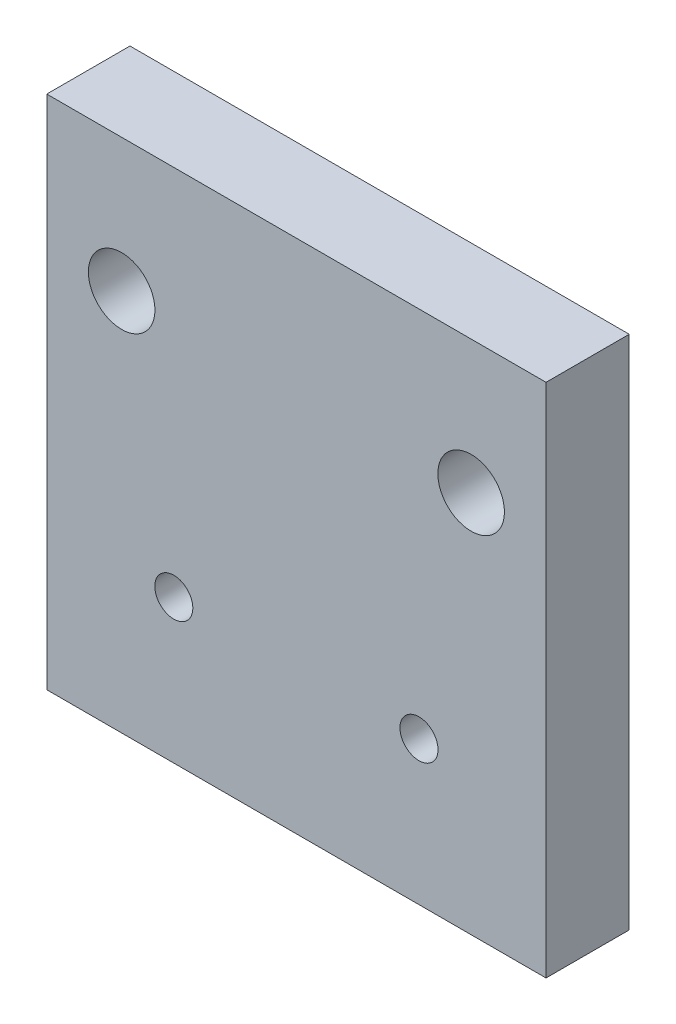
ISO-10303-21;
HEADER;
FILE_DESCRIPTION(('STEP AP214'),'2;1');
FILE_NAME('part.step','',(''),(''),'','','');
FILE_SCHEMA(('AUTOMOTIVE_DESIGN { 1 0 10303 214 1 1 1 1 }'));
ENDSEC;
DATA;
#1=APPLICATION_CONTEXT('core data for automotive mechanical design processes');
#2=APPLICATION_PROTOCOL_DEFINITION('international standard','automotive_design',2000,#1);
#3=PRODUCT_CONTEXT('',#1,'mechanical');
#4=PRODUCT('Part','Part','',(#3));
#5=PRODUCT_RELATED_PRODUCT_CATEGORY('part','',(#4));
#6=PRODUCT_DEFINITION_FORMATION('','',#4);
#7=PRODUCT_DEFINITION_CONTEXT('part definition',#1,'design');
#8=PRODUCT_DEFINITION('design','',#6,#7);
#9=PRODUCT_DEFINITION_SHAPE('','',#8);
#10=(LENGTH_UNIT() NAMED_UNIT(*) SI_UNIT(.MILLI.,.METRE.));
#11=(NAMED_UNIT(*) PLANE_ANGLE_UNIT() SI_UNIT($,.RADIAN.));
#12=(NAMED_UNIT(*) SI_UNIT($,.STERADIAN.) SOLID_ANGLE_UNIT());
#13=UNCERTAINTY_MEASURE_WITH_UNIT(LENGTH_MEASURE(1.E-05),#10,'distance_accuracy_value','');
#14=(GEOMETRIC_REPRESENTATION_CONTEXT(3) GLOBAL_UNCERTAINTY_ASSIGNED_CONTEXT((#13)) GLOBAL_UNIT_ASSIGNED_CONTEXT((#10,
#11,#12)) REPRESENTATION_CONTEXT('',''));
#15=CARTESIAN_POINT('',(0.,0.,0.));
#16=DIRECTION('',(0.,0.,1.));
#17=DIRECTION('',(1.,0.,0.));
#18=AXIS2_PLACEMENT_3D('',#15,#16,#17);
#19=CARTESIAN_POINT('',(-15.,15.5,5.));
#20=DIRECTION('',(1.,0.,0.));
#21=DIRECTION('',(0.,1.,0.));
#22=AXIS2_PLACEMENT_3D('',#19,#20,#21);
#23=PLANE('',#22);
#24=DIRECTION('',(0.,-1.,0.));
#25=VECTOR('',#24,1.);
#26=CARTESIAN_POINT('',(-15.,15.5,0.));
#27=LINE('',#26,#25);
#28=CARTESIAN_POINT('',(-15.,15.5,0.));
#29=VERTEX_POINT('',#28);
#30=CARTESIAN_POINT('',(-15.,-15.5,0.));
#31=VERTEX_POINT('',#30);
#32=EDGE_CURVE('E101',#29,#31,#27,.T.);
#33=ORIENTED_EDGE('',*,*,#32,.T.);
#34=DIRECTION('',(0.,0.,-1.));
#35=VECTOR('',#34,1.);
#36=CARTESIAN_POINT('',(-15.,-15.5,5.));
#37=LINE('',#36,#35);
#38=CARTESIAN_POINT('',(-15.,-15.5,5.));
#39=VERTEX_POINT('',#38);
#40=EDGE_CURVE('E11',#39,#31,#37,.T.);
#41=ORIENTED_EDGE('',*,*,#40,.F.);
#42=DIRECTION('',(0.,-1.,0.));
#43=VECTOR('',#42,1.);
#44=CARTESIAN_POINT('',(-15.,15.5,5.));
#45=LINE('',#44,#43);
#46=CARTESIAN_POINT('',(-15.,15.5,5.));
#47=VERTEX_POINT('',#46);
#48=EDGE_CURVE('E88',#47,#39,#45,.T.);
#49=ORIENTED_EDGE('',*,*,#48,.F.);
#50=DIRECTION('',(0.,0.,-1.));
#51=VECTOR('',#50,1.);
#52=CARTESIAN_POINT('',(-15.,15.5,5.));
#53=LINE('',#52,#51);
#54=EDGE_CURVE('E97',#47,#29,#53,.T.);
#55=ORIENTED_EDGE('',*,*,#54,.T.);
#56=EDGE_LOOP('',(#33,#41,#49,#55));
#57=FACE_BOUND('',#56,.T.);
#58=ADVANCED_FACE('F35',(#57),#23,.F.);
#59=CARTESIAN_POINT('',(-15.,-15.5,5.));
#60=DIRECTION('',(0.,1.,0.));
#61=DIRECTION('',(0.,0.,1.));
#62=AXIS2_PLACEMENT_3D('',#59,#60,#61);
#63=PLANE('',#62);
#64=DIRECTION('',(1.,0.,0.));
#65=VECTOR('',#64,1.);
#66=CARTESIAN_POINT('',(-15.,-15.5,0.));
#67=LINE('',#66,#65);
#68=CARTESIAN_POINT('',(15.,-15.5,0.));
#69=VERTEX_POINT('',#68);
#70=EDGE_CURVE('E92',#31,#69,#67,.T.);
#71=ORIENTED_EDGE('',*,*,#70,.T.);
#72=DIRECTION('',(0.,0.,-1.));
#73=VECTOR('',#72,1.);
#74=CARTESIAN_POINT('',(15.,-15.5,5.));
#75=LINE('',#74,#73);
#76=CARTESIAN_POINT('',(15.,-15.5,5.));
#77=VERTEX_POINT('',#76);
#78=EDGE_CURVE('E44',#77,#69,#75,.T.);
#79=ORIENTED_EDGE('',*,*,#78,.F.);
#80=DIRECTION('',(1.,0.,0.));
#81=VECTOR('',#80,1.);
#82=CARTESIAN_POINT('',(-15.,-15.5,5.));
#83=LINE('',#82,#81);
#84=EDGE_CURVE('E83',#39,#77,#83,.T.);
#85=ORIENTED_EDGE('',*,*,#84,.F.);
#86=ORIENTED_EDGE('',*,*,#40,.T.);
#87=EDGE_LOOP('',(#71,#79,#85,#86));
#88=FACE_BOUND('',#87,.T.);
#89=ADVANCED_FACE('F91',(#88),#63,.F.);
#90=CARTESIAN_POINT('',(15.,15.5,5.));
#91=DIRECTION('',(-1.,0.,0.));
#92=DIRECTION('',(0.,-1.,0.));
#93=AXIS2_PLACEMENT_3D('',#90,#91,#92);
#94=PLANE('',#93);
#95=DIRECTION('',(0.,1.,0.));
#96=VECTOR('',#95,1.);
#97=CARTESIAN_POINT('',(15.,15.5,0.));
#98=LINE('',#97,#96);
#99=CARTESIAN_POINT('',(15.,15.5,0.));
#100=VERTEX_POINT('',#99);
#101=EDGE_CURVE('E70',#69,#100,#98,.T.);
#102=ORIENTED_EDGE('',*,*,#101,.T.);
#103=DIRECTION('',(0.,0.,-1.));
#104=VECTOR('',#103,1.);
#105=CARTESIAN_POINT('',(15.,15.5,5.));
#106=LINE('',#105,#104);
#107=CARTESIAN_POINT('',(15.,15.5,5.));
#108=VERTEX_POINT('',#107);
#109=EDGE_CURVE('E93',#108,#100,#106,.T.);
#110=ORIENTED_EDGE('',*,*,#109,.F.);
#111=DIRECTION('',(0.,1.,0.));
#112=VECTOR('',#111,1.);
#113=CARTESIAN_POINT('',(15.,15.5,5.));
#114=LINE('',#113,#112);
#115=EDGE_CURVE('E86',#77,#108,#114,.T.);
#116=ORIENTED_EDGE('',*,*,#115,.F.);
#117=ORIENTED_EDGE('',*,*,#78,.T.);
#118=EDGE_LOOP('',(#102,#110,#116,#117));
#119=FACE_BOUND('',#118,.T.);
#120=ADVANCED_FACE('F95',(#119),#94,.F.);
#121=CARTESIAN_POINT('',(-15.,15.5,5.));
#122=DIRECTION('',(0.,-1.,0.));
#123=DIRECTION('',(0.,0.,-1.));
#124=AXIS2_PLACEMENT_3D('',#121,#122,#123);
#125=PLANE('',#124);
#126=DIRECTION('',(-1.,0.,0.));
#127=VECTOR('',#126,1.);
#128=CARTESIAN_POINT('',(-15.,15.5,0.));
#129=LINE('',#128,#127);
#130=EDGE_CURVE('E76',#100,#29,#129,.T.);
#131=ORIENTED_EDGE('',*,*,#130,.T.);
#132=ORIENTED_EDGE('',*,*,#54,.F.);
#133=DIRECTION('',(-1.,0.,0.));
#134=VECTOR('',#133,1.);
#135=CARTESIAN_POINT('',(-15.,15.5,5.));
#136=LINE('',#135,#134);
#137=EDGE_CURVE('E53',#108,#47,#136,.T.);
#138=ORIENTED_EDGE('',*,*,#137,.F.);
#139=ORIENTED_EDGE('',*,*,#109,.T.);
#140=EDGE_LOOP('',(#131,#132,#138,#139));
#141=FACE_BOUND('',#140,.T.);
#142=ADVANCED_FACE('F153',(#141),#125,.F.);
#143=CARTESIAN_POINT('',(0.,0.,5.));
#144=DIRECTION('',(0.,0.,1.));
#145=DIRECTION('',(1.,0.,0.));
#146=AXIS2_PLACEMENT_3D('',#143,#144,#145);
#147=PLANE('',#146);
#148=CARTESIAN_POINT('',(7.36600000000006,-6.86600000000009,5.));
#149=DIRECTION('',(0.,0.,1.));
#150=DIRECTION('',(1.,0.,0.));
#151=AXIS2_PLACEMENT_3D('',#148,#149,#150);
#152=CIRCLE('',#151,1.143);
#153=CARTESIAN_POINT('',(8.50900000000006,-6.86600000000009,5.));
#154=VERTEX_POINT('',#153);
#155=EDGE_CURVE('E217',#154,#154,#152,.T.);
#156=ORIENTED_EDGE('',*,*,#155,.F.);
#157=EDGE_LOOP('',(#156));
#158=FACE_BOUND('',#157,.T.);
#159=CARTESIAN_POINT('',(-10.5,7.5,5.));
#160=DIRECTION('',(0.,0.,1.));
#161=DIRECTION('',(1.,0.,0.));
#162=AXIS2_PLACEMENT_3D('',#159,#160,#161);
#163=CIRCLE('',#162,2.);
#164=CARTESIAN_POINT('',(-8.5,7.5,5.));
#165=VERTEX_POINT('',#164);
#166=EDGE_CURVE('E214',#165,#165,#163,.T.);
#167=ORIENTED_EDGE('',*,*,#166,.F.);
#168=EDGE_LOOP('',(#167));
#169=FACE_BOUND('',#168,.T.);
#170=CARTESIAN_POINT('',(10.5,7.5,5.));
#171=DIRECTION('',(0.,0.,1.));
#172=DIRECTION('',(1.,0.,0.));
#173=AXIS2_PLACEMENT_3D('',#170,#171,#172);
#174=CIRCLE('',#173,2.);
#175=CARTESIAN_POINT('',(12.5,7.5,5.));
#176=VERTEX_POINT('',#175);
#177=EDGE_CURVE('E207',#176,#176,#174,.T.);
#178=ORIENTED_EDGE('',*,*,#177,.F.);
#179=EDGE_LOOP('',(#178));
#180=FACE_BOUND('',#179,.T.);
#181=CARTESIAN_POINT('',(-7.36599999999993,-6.86600000000009,5.));
#182=DIRECTION('',(0.,0.,1.));
#183=DIRECTION('',(1.,0.,0.));
#184=AXIS2_PLACEMENT_3D('',#181,#182,#183);
#185=CIRCLE('',#184,1.143);
#186=CARTESIAN_POINT('',(-6.22299999999993,-6.86600000000009,5.));
#187=VERTEX_POINT('',#186);
#188=EDGE_CURVE('E113',#187,#187,#185,.T.);
#189=ORIENTED_EDGE('',*,*,#188,.F.);
#190=EDGE_LOOP('',(#189));
#191=FACE_BOUND('',#190,.T.);
#192=ORIENTED_EDGE('',*,*,#48,.T.);
#193=ORIENTED_EDGE('',*,*,#84,.T.);
#194=ORIENTED_EDGE('',*,*,#115,.T.);
#195=ORIENTED_EDGE('',*,*,#137,.T.);
#196=EDGE_LOOP('',(#192,#193,#194,#195));
#197=FACE_BOUND('',#196,.T.);
#198=ADVANCED_FACE('F84',(#158,#169,#180,#191,#197),#147,.T.);
#199=CARTESIAN_POINT('',(0.,0.,0.));
#200=DIRECTION('',(0.,0.,1.));
#201=DIRECTION('',(1.,0.,0.));
#202=AXIS2_PLACEMENT_3D('',#199,#200,#201);
#203=PLANE('',#202);
#204=CARTESIAN_POINT('',(7.36600000000006,-6.86600000000009,0.));
#205=DIRECTION('',(0.,0.,1.));
#206=DIRECTION('',(1.,0.,0.));
#207=AXIS2_PLACEMENT_3D('',#204,#205,#206);
#208=CIRCLE('',#207,1.143);
#209=CARTESIAN_POINT('',(8.50900000000006,-6.86600000000009,0.));
#210=VERTEX_POINT('',#209);
#211=EDGE_CURVE('E38',#210,#210,#208,.T.);
#212=ORIENTED_EDGE('',*,*,#211,.T.);
#213=EDGE_LOOP('',(#212));
#214=FACE_BOUND('',#213,.T.);
#215=CARTESIAN_POINT('',(-10.5,7.5,0.));
#216=DIRECTION('',(0.,0.,1.));
#217=DIRECTION('',(1.,0.,0.));
#218=AXIS2_PLACEMENT_3D('',#215,#216,#217);
#219=CIRCLE('',#218,2.);
#220=CARTESIAN_POINT('',(-8.5,7.5,0.));
#221=VERTEX_POINT('',#220);
#222=EDGE_CURVE('E115',#221,#221,#219,.T.);
#223=ORIENTED_EDGE('',*,*,#222,.T.);
#224=EDGE_LOOP('',(#223));
#225=FACE_BOUND('',#224,.T.);
#226=CARTESIAN_POINT('',(10.5,7.5,0.));
#227=DIRECTION('',(0.,0.,1.));
#228=DIRECTION('',(1.,0.,0.));
#229=AXIS2_PLACEMENT_3D('',#226,#227,#228);
#230=CIRCLE('',#229,2.);
#231=CARTESIAN_POINT('',(12.5,7.5,0.));
#232=VERTEX_POINT('',#231);
#233=EDGE_CURVE('E112',#232,#232,#230,.T.);
#234=ORIENTED_EDGE('',*,*,#233,.T.);
#235=EDGE_LOOP('',(#234));
#236=FACE_BOUND('',#235,.T.);
#237=CARTESIAN_POINT('',(-7.36599999999993,-6.86600000000009,0.));
#238=DIRECTION('',(0.,0.,1.));
#239=DIRECTION('',(1.,0.,0.));
#240=AXIS2_PLACEMENT_3D('',#237,#238,#239);
#241=CIRCLE('',#240,1.143);
#242=CARTESIAN_POINT('',(-6.22299999999993,-6.86600000000009,0.));
#243=VERTEX_POINT('',#242);
#244=EDGE_CURVE('E109',#243,#243,#241,.T.);
#245=ORIENTED_EDGE('',*,*,#244,.T.);
#246=EDGE_LOOP('',(#245));
#247=FACE_BOUND('',#246,.T.);
#248=ORIENTED_EDGE('',*,*,#32,.F.);
#249=ORIENTED_EDGE('',*,*,#130,.F.);
#250=ORIENTED_EDGE('',*,*,#101,.F.);
#251=ORIENTED_EDGE('',*,*,#70,.F.);
#252=EDGE_LOOP('',(#248,#249,#250,#251));
#253=FACE_BOUND('',#252,.T.);
#254=ADVANCED_FACE('F122',(#214,#225,#236,#247,#253),#203,.F.);
#255=CARTESIAN_POINT('',(-7.36599999999993,-6.86600000000009,-5.));
#256=DIRECTION('',(0.,0.,1.));
#257=DIRECTION('',(1.,0.,0.));
#258=AXIS2_PLACEMENT_3D('',#255,#256,#257);
#259=CYLINDRICAL_SURFACE('',#258,1.143);
#260=ORIENTED_EDGE('',*,*,#188,.T.);
#261=EDGE_LOOP('',(#260));
#262=FACE_BOUND('',#261,.T.);
#263=ORIENTED_EDGE('',*,*,#244,.F.);
#264=EDGE_LOOP('',(#263));
#265=FACE_BOUND('',#264,.T.);
#266=ADVANCED_FACE('F145',(#262,#265),#259,.F.);
#267=CARTESIAN_POINT('',(10.5,7.5,-5.));
#268=DIRECTION('',(0.,0.,1.));
#269=DIRECTION('',(1.,0.,0.));
#270=AXIS2_PLACEMENT_3D('',#267,#268,#269);
#271=CYLINDRICAL_SURFACE('',#270,2.);
#272=ORIENTED_EDGE('',*,*,#177,.T.);
#273=EDGE_LOOP('',(#272));
#274=FACE_BOUND('',#273,.T.);
#275=ORIENTED_EDGE('',*,*,#233,.F.);
#276=EDGE_LOOP('',(#275));
#277=FACE_BOUND('',#276,.T.);
#278=ADVANCED_FACE('F132',(#274,#277),#271,.F.);
#279=CARTESIAN_POINT('',(-10.5,7.5,-5.));
#280=DIRECTION('',(0.,0.,1.));
#281=DIRECTION('',(1.,0.,0.));
#282=AXIS2_PLACEMENT_3D('',#279,#280,#281);
#283=CYLINDRICAL_SURFACE('',#282,2.);
#284=ORIENTED_EDGE('',*,*,#166,.T.);
#285=EDGE_LOOP('',(#284));
#286=FACE_BOUND('',#285,.T.);
#287=ORIENTED_EDGE('',*,*,#222,.F.);
#288=EDGE_LOOP('',(#287));
#289=FACE_BOUND('',#288,.T.);
#290=ADVANCED_FACE('F126',(#286,#289),#283,.F.);
#291=CARTESIAN_POINT('',(7.36600000000006,-6.86600000000009,-5.));
#292=DIRECTION('',(0.,0.,1.));
#293=DIRECTION('',(1.,0.,0.));
#294=AXIS2_PLACEMENT_3D('',#291,#292,#293);
#295=CYLINDRICAL_SURFACE('',#294,1.143);
#296=ORIENTED_EDGE('',*,*,#155,.T.);
#297=EDGE_LOOP('',(#296));
#298=FACE_BOUND('',#297,.T.);
#299=ORIENTED_EDGE('',*,*,#211,.F.);
#300=EDGE_LOOP('',(#299));
#301=FACE_BOUND('',#300,.T.);
#302=ADVANCED_FACE('F124',(#298,#301),#295,.F.);
#303=CLOSED_SHELL('',(#58,#89,#120,#142,#198,#254,#266,#278,#290,#302));
#304=MANIFOLD_SOLID_BREP('B2',#303);
#305=ADVANCED_BREP_SHAPE_REPRESENTATION('',(#18,#304),#14);
#306=SHAPE_DEFINITION_REPRESENTATION(#9,#305);
ENDSEC;
END-ISO-10303-21;
